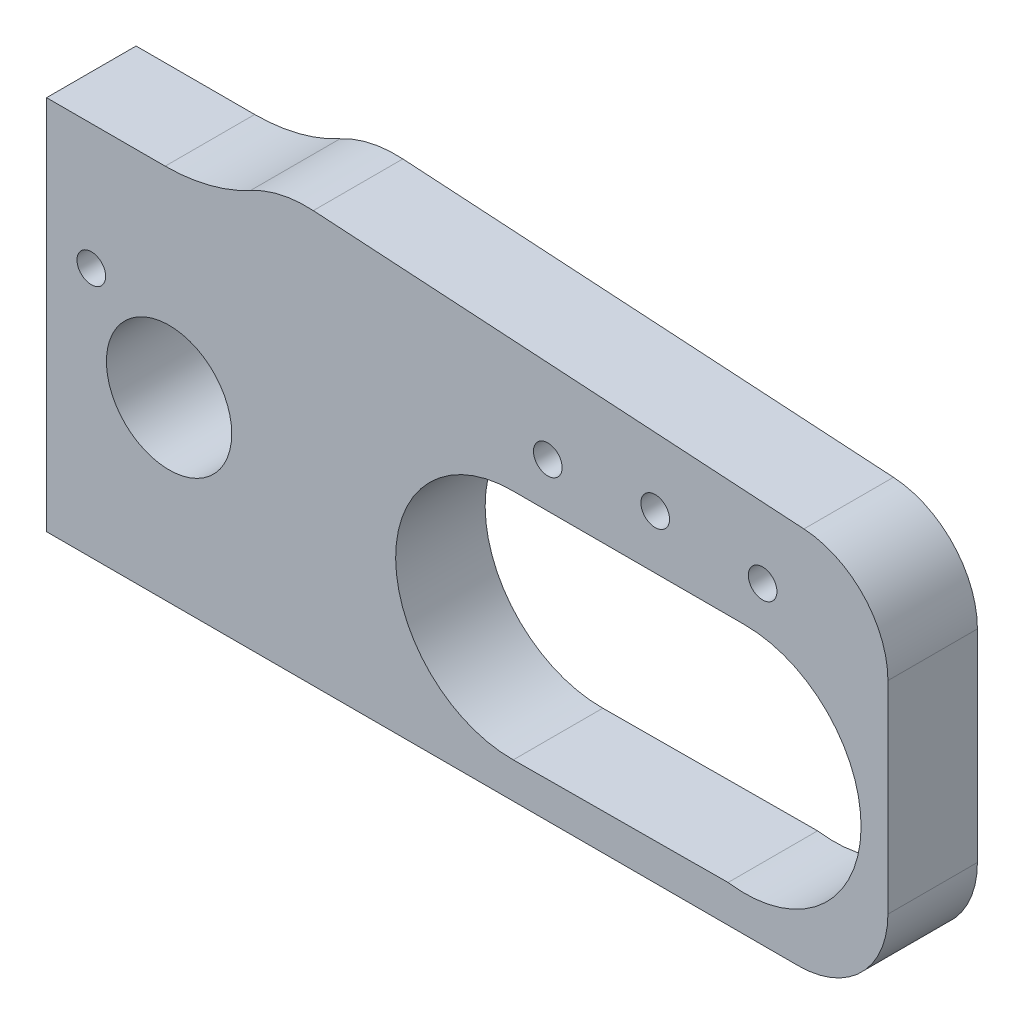
ISO-10303-21;
HEADER;
FILE_DESCRIPTION(('STEP AP214'),'2;1');
FILE_NAME('part.step','',(''),(''),'','','');
FILE_SCHEMA(('AUTOMOTIVE_DESIGN { 1 0 10303 214 1 1 1 1 }'));
ENDSEC;
DATA;
#1=APPLICATION_CONTEXT('core data for automotive mechanical design processes');
#2=APPLICATION_PROTOCOL_DEFINITION('international standard','automotive_design',2000,#1);
#3=PRODUCT_CONTEXT('',#1,'mechanical');
#4=PRODUCT('Part','Part','',(#3));
#5=PRODUCT_RELATED_PRODUCT_CATEGORY('part','',(#4));
#6=PRODUCT_DEFINITION_FORMATION('','',#4);
#7=PRODUCT_DEFINITION_CONTEXT('part definition',#1,'design');
#8=PRODUCT_DEFINITION('design','',#6,#7);
#9=PRODUCT_DEFINITION_SHAPE('','',#8);
#10=(LENGTH_UNIT() NAMED_UNIT(*) SI_UNIT(.MILLI.,.METRE.));
#11=(NAMED_UNIT(*) PLANE_ANGLE_UNIT() SI_UNIT($,.RADIAN.));
#12=(NAMED_UNIT(*) SI_UNIT($,.STERADIAN.) SOLID_ANGLE_UNIT());
#13=UNCERTAINTY_MEASURE_WITH_UNIT(LENGTH_MEASURE(1.E-05),#10,'distance_accuracy_value','');
#14=(GEOMETRIC_REPRESENTATION_CONTEXT(3) GLOBAL_UNCERTAINTY_ASSIGNED_CONTEXT((#13)) GLOBAL_UNIT_ASSIGNED_CONTEXT((#10,
#11,#12)) REPRESENTATION_CONTEXT('',''));
#15=CARTESIAN_POINT('',(0.,0.,0.));
#16=DIRECTION('',(0.,0.,1.));
#17=DIRECTION('',(1.,0.,0.));
#18=AXIS2_PLACEMENT_3D('',#15,#16,#17);
#19=CARTESIAN_POINT('',(-9.43815787852776,8.12368424294449,5.));
#20=DIRECTION('',(0.,0.,-1.));
#21=DIRECTION('',(-1.,0.,0.));
#22=AXIS2_PLACEMENT_3D('',#19,#20,#21);
#23=CYLINDRICAL_SURFACE('',#22,5.1);
#24=CARTESIAN_POINT('',(-9.43815787852776,8.12368424294449,0.));
#25=DIRECTION('',(0.,0.,1.));
#26=DIRECTION('',(1.,0.,0.));
#27=AXIS2_PLACEMENT_3D('',#24,#25,#26);
#28=CIRCLE('',#27,5.1);
#29=CARTESIAN_POINT('',(-4.33815787852776,8.12368424294449,0.));
#30=VERTEX_POINT('',#29);
#31=EDGE_CURVE('E183',#30,#30,#28,.T.);
#32=ORIENTED_EDGE('',*,*,#31,.F.);
#33=EDGE_LOOP('',(#32));
#34=FACE_BOUND('',#33,.T.);
#35=CARTESIAN_POINT('',(-9.43815787852776,8.12368424294449,4.));
#36=DIRECTION('',(0.,0.,1.));
#37=DIRECTION('',(1.,0.,0.));
#38=AXIS2_PLACEMENT_3D('',#35,#36,#37);
#39=CIRCLE('',#38,5.1);
#40=CARTESIAN_POINT('',(-4.33815787852776,8.12368424294449,4.));
#41=VERTEX_POINT('',#40);
#42=EDGE_CURVE('E398',#41,#41,#39,.T.);
#43=ORIENTED_EDGE('',*,*,#42,.T.);
#44=EDGE_LOOP('',(#43));
#45=FACE_BOUND('',#44,.T.);
#46=ADVANCED_FACE('F43',(#34,#45),#23,.F.);
#47=CARTESIAN_POINT('',(23.0618421214722,0.,5.));
#48=DIRECTION('',(1.,0.,0.));
#49=DIRECTION('',(0.,0.,-1.));
#50=AXIS2_PLACEMENT_3D('',#47,#48,#49);
#51=PLANE('',#50);
#52=DIRECTION('',(0.,-1.,0.));
#53=VECTOR('',#52,1.);
#54=CARTESIAN_POINT('',(23.0618421214722,0.,0.));
#55=LINE('',#54,#53);
#56=CARTESIAN_POINT('',(23.0618421214722,7.92371533758916,0.));
#57=VERTEX_POINT('',#56);
#58=CARTESIAN_POINT('',(23.0618421214722,-3.37631575705552,0.));
#59=VERTEX_POINT('',#58);
#60=EDGE_CURVE('E206',#57,#59,#55,.T.);
#61=ORIENTED_EDGE('',*,*,#60,.F.);
#62=DIRECTION('',(0.,0.,-1.));
#63=VECTOR('',#62,1.);
#64=CARTESIAN_POINT('',(23.0618421214722,7.92371533758916,5.));
#65=LINE('',#64,#63);
#66=CARTESIAN_POINT('',(23.0618421214722,7.92371533758916,5.));
#67=VERTEX_POINT('',#66);
#68=EDGE_CURVE('E11',#67,#57,#65,.T.);
#69=ORIENTED_EDGE('',*,*,#68,.F.);
#70=DIRECTION('',(0.,-1.,0.));
#71=VECTOR('',#70,1.);
#72=CARTESIAN_POINT('',(23.0618421214722,0.,5.));
#73=LINE('',#72,#71);
#74=CARTESIAN_POINT('',(23.0618421214722,-3.37631575705552,5.));
#75=VERTEX_POINT('',#74);
#76=EDGE_CURVE('E287',#67,#75,#73,.T.);
#77=ORIENTED_EDGE('',*,*,#76,.T.);
#78=DIRECTION('',(0.,0.,-1.));
#79=VECTOR('',#78,1.);
#80=CARTESIAN_POINT('',(23.0618421214722,-3.37631575705552,5.));
#81=LINE('',#80,#79);
#82=EDGE_CURVE('E115',#75,#59,#81,.T.);
#83=ORIENTED_EDGE('',*,*,#82,.T.);
#84=EDGE_LOOP('',(#61,#69,#77,#83));
#85=FACE_BOUND('',#84,.T.);
#86=ADVANCED_FACE('F323',(#85),#51,.T.);
#87=CARTESIAN_POINT('',(18.0618421214722,7.9237153375891,5.));
#88=DIRECTION('',(0.,0.,-1.));
#89=DIRECTION('',(-1.,0.,0.));
#90=AXIS2_PLACEMENT_3D('',#87,#88,#89);
#91=CYLINDRICAL_SURFACE('',#90,5.);
#92=CARTESIAN_POINT('',(18.0618421214722,7.9237153375891,0.));
#93=DIRECTION('',(0.,0.,1.));
#94=DIRECTION('',(1.,0.,0.));
#95=AXIS2_PLACEMENT_3D('',#92,#93,#94);
#96=CIRCLE('',#95,5.);
#97=CARTESIAN_POINT('',(18.3708578735485,12.9141571281492,0.));
#98=VERTEX_POINT('',#97);
#99=EDGE_CURVE('E212',#57,#98,#96,.T.);
#100=ORIENTED_EDGE('',*,*,#99,.T.);
#101=DIRECTION('',(0.,0.,-1.));
#102=VECTOR('',#101,1.);
#103=CARTESIAN_POINT('',(18.3708578735485,12.9141571281492,5.));
#104=LINE('',#103,#102);
#105=CARTESIAN_POINT('',(18.3708578735485,12.9141571281492,5.));
#106=VERTEX_POINT('',#105);
#107=EDGE_CURVE('E52',#106,#98,#104,.T.);
#108=ORIENTED_EDGE('',*,*,#107,.F.);
#109=CARTESIAN_POINT('',(18.0618421214722,7.9237153375891,5.));
#110=DIRECTION('',(0.,0.,1.));
#111=DIRECTION('',(1.,0.,0.));
#112=AXIS2_PLACEMENT_3D('',#109,#110,#111);
#113=CIRCLE('',#112,5.);
#114=EDGE_CURVE('E289',#67,#106,#113,.T.);
#115=ORIENTED_EDGE('',*,*,#114,.F.);
#116=ORIENTED_EDGE('',*,*,#68,.T.);
#117=EDGE_LOOP('',(#100,#108,#115,#116));
#118=FACE_BOUND('',#117,.T.);
#119=ADVANCED_FACE('F330',(#118),#91,.T.);
#120=CARTESIAN_POINT('',(0.866779714900697,13.9980362922802,5.));
#121=DIRECTION('',(-0.0618031504152585,-0.998088358112021,0.));
#122=DIRECTION('',(0.998088358112021,-0.0618031504152585,0.));
#123=AXIS2_PLACEMENT_3D('',#120,#121,#122);
#124=PLANE('',#123);
#125=DIRECTION('',(-0.998088358112021,0.0618031504152585,0.));
#126=VECTOR('',#125,1.);
#127=CARTESIAN_POINT('',(0.866779714900697,13.9980362922802,0.));
#128=LINE('',#127,#126);
#129=CARTESIAN_POINT('',(-9.03643740082861,14.6112585706726,0.));
#130=VERTEX_POINT('',#129);
#131=EDGE_CURVE('E211',#98,#130,#128,.T.);
#132=ORIENTED_EDGE('',*,*,#131,.T.);
#133=DIRECTION('',(0.,0.,-1.));
#134=VECTOR('',#133,1.);
#135=CARTESIAN_POINT('',(-9.03643740082861,14.6112585706726,5.));
#136=LINE('',#135,#134);
#137=CARTESIAN_POINT('',(-9.03643740082861,14.6112585706726,5.));
#138=VERTEX_POINT('',#137);
#139=EDGE_CURVE('E239',#138,#130,#136,.T.);
#140=ORIENTED_EDGE('',*,*,#139,.F.);
#141=DIRECTION('',(-0.998088358112021,0.0618031504152585,0.));
#142=VECTOR('',#141,1.);
#143=CARTESIAN_POINT('',(0.866779714900697,13.9980362922802,5.));
#144=LINE('',#143,#142);
#145=EDGE_CURVE('E291',#106,#138,#144,.T.);
#146=ORIENTED_EDGE('',*,*,#145,.F.);
#147=ORIENTED_EDGE('',*,*,#107,.T.);
#148=EDGE_LOOP('',(#132,#140,#146,#147));
#149=FACE_BOUND('',#148,.T.);
#150=ADVANCED_FACE('F358',(#149),#124,.F.);
#151=CARTESIAN_POINT('',(-9.43815787852776,8.12368424294449,5.));
#152=DIRECTION('',(0.,0.,-1.));
#153=DIRECTION('',(-1.,0.,0.));
#154=AXIS2_PLACEMENT_3D('',#151,#152,#153);
#155=CYLINDRICAL_SURFACE('',#154,6.49999999999999);
#156=CARTESIAN_POINT('',(-9.43815787852776,8.12368424294449,0.));
#157=DIRECTION('',(0.,0.,1.));
#158=DIRECTION('',(1.,0.,0.));
#159=AXIS2_PLACEMENT_3D('',#156,#157,#158);
#160=CIRCLE('',#159,6.49999999999999);
#161=CARTESIAN_POINT('',(-12.54003976829,13.8358054550657,0.));
#162=VERTEX_POINT('',#161);
#163=EDGE_CURVE('E220',#130,#162,#160,.T.);
#164=ORIENTED_EDGE('',*,*,#163,.T.);
#165=DIRECTION('',(0.,0.,-1.));
#166=VECTOR('',#165,1.);
#167=CARTESIAN_POINT('',(-12.54003976829,13.8358054550657,5.));
#168=LINE('',#167,#166);
#169=CARTESIAN_POINT('',(-12.54003976829,13.8358054550657,5.));
#170=VERTEX_POINT('',#169);
#171=EDGE_CURVE('E237',#170,#162,#168,.T.);
#172=ORIENTED_EDGE('',*,*,#171,.F.);
#173=CARTESIAN_POINT('',(-9.43815787852776,8.12368424294449,5.));
#174=DIRECTION('',(0.,0.,1.));
#175=DIRECTION('',(1.,0.,0.));
#176=AXIS2_PLACEMENT_3D('',#173,#174,#175);
#177=CIRCLE('',#176,6.49999999999999);
#178=EDGE_CURVE('E292',#138,#170,#177,.T.);
#179=ORIENTED_EDGE('',*,*,#178,.F.);
#180=ORIENTED_EDGE('',*,*,#139,.T.);
#181=EDGE_LOOP('',(#164,#172,#179,#180));
#182=FACE_BOUND('',#181,.T.);
#183=ADVANCED_FACE('F361',(#182),#155,.T.);
#184=CARTESIAN_POINT('',(-17.3121657525396,22.6236842429445,5.));
#185=DIRECTION('',(0.,0.,-1.));
#186=DIRECTION('',(-1.,0.,0.));
#187=AXIS2_PLACEMENT_3D('',#184,#185,#186);
#188=CYLINDRICAL_SURFACE('',#187,10.);
#189=CARTESIAN_POINT('',(-17.3121657525396,22.6236842429445,0.));
#190=DIRECTION('',(0.,0.,1.));
#191=DIRECTION('',(1.,0.,0.));
#192=AXIS2_PLACEMENT_3D('',#189,#190,#191);
#193=CIRCLE('',#192,10.);
#194=CARTESIAN_POINT('',(-17.3121657525395,12.6236842429445,0.));
#195=VERTEX_POINT('',#194);
#196=EDGE_CURVE('E219',#195,#162,#193,.T.);
#197=ORIENTED_EDGE('',*,*,#196,.F.);
#198=DIRECTION('',(0.,0.,-1.));
#199=VECTOR('',#198,1.);
#200=CARTESIAN_POINT('',(-17.3121657525395,12.6236842429445,5.));
#201=LINE('',#200,#199);
#202=CARTESIAN_POINT('',(-17.3121657525395,12.6236842429445,5.));
#203=VERTEX_POINT('',#202);
#204=EDGE_CURVE('E234',#203,#195,#201,.T.);
#205=ORIENTED_EDGE('',*,*,#204,.F.);
#206=CARTESIAN_POINT('',(-17.3121657525396,22.6236842429445,5.));
#207=DIRECTION('',(0.,0.,1.));
#208=DIRECTION('',(1.,0.,0.));
#209=AXIS2_PLACEMENT_3D('',#206,#207,#208);
#210=CIRCLE('',#209,10.);
#211=EDGE_CURVE('E175',#203,#170,#210,.T.);
#212=ORIENTED_EDGE('',*,*,#211,.T.);
#213=ORIENTED_EDGE('',*,*,#171,.T.);
#214=EDGE_LOOP('',(#197,#205,#212,#213));
#215=FACE_BOUND('',#214,.T.);
#216=ADVANCED_FACE('F298',(#215),#188,.F.);
#217=CARTESIAN_POINT('',(0.,12.6236842429445,5.));
#218=DIRECTION('',(0.,1.,0.));
#219=DIRECTION('',(-1.,0.,0.));
#220=AXIS2_PLACEMENT_3D('',#217,#218,#219);
#221=PLANE('',#220);
#222=DIRECTION('',(1.,0.,0.));
#223=VECTOR('',#222,1.);
#224=CARTESIAN_POINT('',(0.,12.6236842429445,0.));
#225=LINE('',#224,#223);
#226=CARTESIAN_POINT('',(-23.9381578785278,12.6236842429445,0.));
#227=VERTEX_POINT('',#226);
#228=EDGE_CURVE('E223',#227,#195,#225,.T.);
#229=ORIENTED_EDGE('',*,*,#228,.F.);
#230=DIRECTION('',(0.,0.,-1.));
#231=VECTOR('',#230,1.);
#232=CARTESIAN_POINT('',(-23.9381578785278,12.6236842429445,5.));
#233=LINE('',#232,#231);
#234=CARTESIAN_POINT('',(-23.9381578785278,12.6236842429445,5.));
#235=VERTEX_POINT('',#234);
#236=EDGE_CURVE('E159',#235,#227,#233,.T.);
#237=ORIENTED_EDGE('',*,*,#236,.F.);
#238=DIRECTION('',(1.,0.,0.));
#239=VECTOR('',#238,1.);
#240=CARTESIAN_POINT('',(0.,12.6236842429445,5.));
#241=LINE('',#240,#239);
#242=EDGE_CURVE('E169',#235,#203,#241,.T.);
#243=ORIENTED_EDGE('',*,*,#242,.T.);
#244=ORIENTED_EDGE('',*,*,#204,.T.);
#245=EDGE_LOOP('',(#229,#237,#243,#244));
#246=FACE_BOUND('',#245,.T.);
#247=ADVANCED_FACE('F304',(#246),#221,.T.);
#248=CARTESIAN_POINT('',(-23.9381578785278,0.,5.));
#249=DIRECTION('',(-1.,0.,0.));
#250=DIRECTION('',(0.,0.,1.));
#251=AXIS2_PLACEMENT_3D('',#248,#249,#250);
#252=PLANE('',#251);
#253=CARTESIAN_POINT('',(-23.9381578785278,9.62368424294448,2.5));
#254=DIRECTION('',(-1.,0.,0.));
#255=DIRECTION('',(0.,0.,1.));
#256=AXIS2_PLACEMENT_3D('',#253,#254,#255);
#257=CIRCLE('',#256,1.25);
#258=CARTESIAN_POINT('',(-23.9381578785278,9.62368424294448,3.75));
#259=VERTEX_POINT('',#258);
#260=EDGE_CURVE('E403',#259,#259,#257,.T.);
#261=ORIENTED_EDGE('',*,*,#260,.F.);
#262=EDGE_LOOP('',(#261));
#263=FACE_BOUND('',#262,.T.);
#264=CARTESIAN_POINT('',(-23.9381578785278,-2.87631575705552,2.5));
#265=DIRECTION('',(-1.,0.,0.));
#266=DIRECTION('',(0.,0.,1.));
#267=AXIS2_PLACEMENT_3D('',#264,#265,#266);
#268=CIRCLE('',#267,1.25);
#269=CARTESIAN_POINT('',(-23.9381578785278,-2.87631575705552,3.75));
#270=VERTEX_POINT('',#269);
#271=EDGE_CURVE('E400',#270,#270,#268,.T.);
#272=ORIENTED_EDGE('',*,*,#271,.F.);
#273=EDGE_LOOP('',(#272));
#274=FACE_BOUND('',#273,.T.);
#275=DIRECTION('',(0.,1.,0.));
#276=VECTOR('',#275,1.);
#277=CARTESIAN_POINT('',(-23.9381578785278,0.,0.));
#278=LINE('',#277,#276);
#279=CARTESIAN_POINT('',(-23.9381578785278,-8.37631575705552,0.));
#280=VERTEX_POINT('',#279);
#281=EDGE_CURVE('E157',#280,#227,#278,.T.);
#282=ORIENTED_EDGE('',*,*,#281,.F.);
#283=DIRECTION('',(0.,0.,-1.));
#284=VECTOR('',#283,1.);
#285=CARTESIAN_POINT('',(-23.9381578785278,-8.37631575705552,5.));
#286=LINE('',#285,#284);
#287=CARTESIAN_POINT('',(-23.9381578785278,-8.37631575705552,5.));
#288=VERTEX_POINT('',#287);
#289=EDGE_CURVE('E146',#288,#280,#286,.T.);
#290=ORIENTED_EDGE('',*,*,#289,.F.);
#291=DIRECTION('',(0.,1.,0.));
#292=VECTOR('',#291,1.);
#293=CARTESIAN_POINT('',(-23.9381578785278,0.,5.));
#294=LINE('',#293,#292);
#295=EDGE_CURVE('E155',#288,#235,#294,.T.);
#296=ORIENTED_EDGE('',*,*,#295,.T.);
#297=ORIENTED_EDGE('',*,*,#236,.T.);
#298=EDGE_LOOP('',(#282,#290,#296,#297));
#299=FACE_BOUND('',#298,.T.);
#300=ADVANCED_FACE('F154',(#263,#274,#299),#252,.T.);
#301=CARTESIAN_POINT('',(0.,-8.37631575705552,5.));
#302=DIRECTION('',(0.,1.,0.));
#303=DIRECTION('',(-1.,0.,0.));
#304=AXIS2_PLACEMENT_3D('',#301,#302,#303);
#305=PLANE('',#304);
#306=DIRECTION('',(1.,0.,0.));
#307=VECTOR('',#306,1.);
#308=CARTESIAN_POINT('',(0.,-8.37631575705552,0.));
#309=LINE('',#308,#307);
#310=CARTESIAN_POINT('',(18.0618421214723,-8.37631575705552,0.));
#311=VERTEX_POINT('',#310);
#312=EDGE_CURVE('E229',#280,#311,#309,.T.);
#313=ORIENTED_EDGE('',*,*,#312,.T.);
#314=DIRECTION('',(0.,0.,-1.));
#315=VECTOR('',#314,1.);
#316=CARTESIAN_POINT('',(18.0618421214723,-8.37631575705552,5.));
#317=LINE('',#316,#315);
#318=CARTESIAN_POINT('',(18.0618421214723,-8.37631575705552,5.));
#319=VERTEX_POINT('',#318);
#320=EDGE_CURVE('E158',#319,#311,#317,.T.);
#321=ORIENTED_EDGE('',*,*,#320,.F.);
#322=DIRECTION('',(1.,0.,0.));
#323=VECTOR('',#322,1.);
#324=CARTESIAN_POINT('',(0.,-8.37631575705552,5.));
#325=LINE('',#324,#323);
#326=EDGE_CURVE('E164',#288,#319,#325,.T.);
#327=ORIENTED_EDGE('',*,*,#326,.F.);
#328=ORIENTED_EDGE('',*,*,#289,.T.);
#329=EDGE_LOOP('',(#313,#321,#327,#328));
#330=FACE_BOUND('',#329,.T.);
#331=ADVANCED_FACE('F161',(#330),#305,.F.);
#332=CARTESIAN_POINT('',(15.0618421214712,0.123684242944485,5.));
#333=DIRECTION('',(0.,0.,-1.));
#334=DIRECTION('',(-1.,0.,0.));
#335=AXIS2_PLACEMENT_3D('',#332,#333,#334);
#336=CYLINDRICAL_SURFACE('',#335,6.5);
#337=CARTESIAN_POINT('',(15.0618421214712,0.123684242944485,0.));
#338=DIRECTION('',(0.,0.,1.));
#339=DIRECTION('',(1.,0.,0.));
#340=AXIS2_PLACEMENT_3D('',#337,#338,#339);
#341=CIRCLE('',#340,6.5);
#342=CARTESIAN_POINT('',(14.1329018950054,-6.30959408584354,0.));
#343=VERTEX_POINT('',#342);
#344=CARTESIAN_POINT('',(15.0618421214722,6.62368424294448,0.));
#345=VERTEX_POINT('',#344);
#346=EDGE_CURVE('E184',#343,#345,#341,.T.);
#347=ORIENTED_EDGE('',*,*,#346,.F.);
#348=DIRECTION('',(0.,0.,-1.));
#349=VECTOR('',#348,1.);
#350=CARTESIAN_POINT('',(14.1329018950054,-6.30959408584354,5.));
#351=LINE('',#350,#349);
#352=CARTESIAN_POINT('',(14.1329018950054,-6.30959408584354,5.));
#353=VERTEX_POINT('',#352);
#354=EDGE_CURVE('E50',#353,#343,#351,.T.);
#355=ORIENTED_EDGE('',*,*,#354,.F.);
#356=CARTESIAN_POINT('',(15.0618421214712,0.123684242944485,5.));
#357=DIRECTION('',(0.,0.,1.));
#358=DIRECTION('',(1.,0.,0.));
#359=AXIS2_PLACEMENT_3D('',#356,#357,#358);
#360=CIRCLE('',#359,6.5);
#361=CARTESIAN_POINT('',(15.0618421214722,6.62368424294448,5.));
#362=VERTEX_POINT('',#361);
#363=EDGE_CURVE('E388',#353,#362,#360,.T.);
#364=ORIENTED_EDGE('',*,*,#363,.T.);
#365=DIRECTION('',(0.,0.,-1.));
#366=VECTOR('',#365,1.);
#367=CARTESIAN_POINT('',(15.0618421214722,6.62368424294448,5.));
#368=LINE('',#367,#366);
#369=EDGE_CURVE('E179',#362,#345,#368,.T.);
#370=ORIENTED_EDGE('',*,*,#369,.T.);
#371=EDGE_LOOP('',(#347,#355,#364,#370));
#372=FACE_BOUND('',#371,.T.);
#373=ADVANCED_FACE('F251',(#372),#336,.F.);
#374=CARTESIAN_POINT('',(0.035306413320846,-6.38751724654818,5.));
#375=DIRECTION('',(-0.00552732346942933,0.999984724230958,0.));
#376=DIRECTION('',(-0.999984724230958,-0.00552732346942933,0.));
#377=AXIS2_PLACEMENT_3D('',#374,#375,#376);
#378=PLANE('',#377);
#379=DIRECTION('',(0.999984724230958,0.00552732346942933,0.));
#380=VECTOR('',#379,1.);
#381=CARTESIAN_POINT('',(0.035306413320846,-6.38751724654818,0.));
#382=LINE('',#381,#380);
#383=CARTESIAN_POINT('',(2.13369622893157,-6.37591859009395,0.));
#384=VERTEX_POINT('',#383);
#385=EDGE_CURVE('E186',#384,#343,#382,.T.);
#386=ORIENTED_EDGE('',*,*,#385,.F.);
#387=DIRECTION('',(0.,0.,-1.));
#388=VECTOR('',#387,1.);
#389=CARTESIAN_POINT('',(2.13369622893157,-6.37591859009395,5.));
#390=LINE('',#389,#388);
#391=CARTESIAN_POINT('',(2.13369622893157,-6.37591859009395,5.));
#392=VERTEX_POINT('',#391);
#393=EDGE_CURVE('E244',#392,#384,#390,.T.);
#394=ORIENTED_EDGE('',*,*,#393,.F.);
#395=DIRECTION('',(0.999984724230958,0.00552732346942933,0.));
#396=VECTOR('',#395,1.);
#397=CARTESIAN_POINT('',(0.035306413320846,-6.38751724654818,5.));
#398=LINE('',#397,#396);
#399=EDGE_CURVE('E255',#392,#353,#398,.T.);
#400=ORIENTED_EDGE('',*,*,#399,.T.);
#401=ORIENTED_EDGE('',*,*,#354,.T.);
#402=EDGE_LOOP('',(#386,#394,#400,#401));
#403=FACE_BOUND('',#402,.T.);
#404=ADVANCED_FACE('F254',(#403),#378,.T.);
#405=CARTESIAN_POINT('',(2.06184212147224,0.123684242944485,5.));
#406=DIRECTION('',(0.,0.,-1.));
#407=DIRECTION('',(-1.,0.,0.));
#408=AXIS2_PLACEMENT_3D('',#405,#406,#407);
#409=CYLINDRICAL_SURFACE('',#408,6.5);
#410=CARTESIAN_POINT('',(2.06184212147224,0.123684242944485,0.));
#411=DIRECTION('',(0.,0.,1.));
#412=DIRECTION('',(1.,0.,0.));
#413=AXIS2_PLACEMENT_3D('',#410,#411,#412);
#414=CIRCLE('',#413,6.5);
#415=CARTESIAN_POINT('',(2.06184212147224,6.62368424294448,0.));
#416=VERTEX_POINT('',#415);
#417=EDGE_CURVE('E191',#416,#384,#414,.T.);
#418=ORIENTED_EDGE('',*,*,#417,.F.);
#419=DIRECTION('',(0.,0.,-1.));
#420=VECTOR('',#419,1.);
#421=CARTESIAN_POINT('',(2.06184212147224,6.62368424294448,5.));
#422=LINE('',#421,#420);
#423=CARTESIAN_POINT('',(2.06184212147224,6.62368424294448,5.));
#424=VERTEX_POINT('',#423);
#425=EDGE_CURVE('E242',#424,#416,#422,.T.);
#426=ORIENTED_EDGE('',*,*,#425,.F.);
#427=CARTESIAN_POINT('',(2.06184212147224,0.123684242944485,5.));
#428=DIRECTION('',(0.,0.,1.));
#429=DIRECTION('',(1.,0.,0.));
#430=AXIS2_PLACEMENT_3D('',#427,#428,#429);
#431=CIRCLE('',#430,6.5);
#432=EDGE_CURVE('E265',#424,#392,#431,.T.);
#433=ORIENTED_EDGE('',*,*,#432,.T.);
#434=ORIENTED_EDGE('',*,*,#393,.T.);
#435=EDGE_LOOP('',(#418,#426,#433,#434));
#436=FACE_BOUND('',#435,.T.);
#437=ADVANCED_FACE('F259',(#436),#409,.F.);
#438=CARTESIAN_POINT('',(-21.4381578785278,5.62368424294448,5.));
#439=DIRECTION('',(0.,0.,-1.));
#440=DIRECTION('',(-1.,0.,0.));
#441=AXIS2_PLACEMENT_3D('',#438,#439,#440);
#442=CYLINDRICAL_SURFACE('',#441,0.8);
#443=CARTESIAN_POINT('',(-21.4381578785278,5.62368424294448,5.));
#444=DIRECTION('',(0.,0.,1.));
#445=DIRECTION('',(1.,0.,0.));
#446=AXIS2_PLACEMENT_3D('',#443,#444,#445);
#447=CIRCLE('',#446,0.8);
#448=CARTESIAN_POINT('',(-20.6381578785278,5.62368424294448,5.));
#449=VERTEX_POINT('',#448);
#450=EDGE_CURVE('E284',#449,#449,#447,.T.);
#451=ORIENTED_EDGE('',*,*,#450,.T.);
#452=EDGE_LOOP('',(#451));
#453=FACE_BOUND('',#452,.T.);
#454=CARTESIAN_POINT('',(-21.4381578785278,5.62368424294448,0.));
#455=DIRECTION('',(0.,0.,1.));
#456=DIRECTION('',(1.,0.,0.));
#457=AXIS2_PLACEMENT_3D('',#454,#455,#456);
#458=CIRCLE('',#457,0.8);
#459=CARTESIAN_POINT('',(-20.6381578785278,5.62368424294448,0.));
#460=VERTEX_POINT('',#459);
#461=EDGE_CURVE('E207',#460,#460,#458,.T.);
#462=ORIENTED_EDGE('',*,*,#461,.F.);
#463=EDGE_LOOP('',(#462));
#464=FACE_BOUND('',#463,.T.);
#465=ADVANCED_FACE('F337',(#453,#464),#442,.F.);
#466=CARTESIAN_POINT('',(4.06184212147224,9.12368424294448,5.));
#467=DIRECTION('',(0.,0.,-1.));
#468=DIRECTION('',(-1.,0.,0.));
#469=AXIS2_PLACEMENT_3D('',#466,#467,#468);
#470=CYLINDRICAL_SURFACE('',#469,0.800000000000001);
#471=CARTESIAN_POINT('',(4.06184212147224,9.12368424294448,5.));
#472=DIRECTION('',(0.,0.,1.));
#473=DIRECTION('',(1.,0.,0.));
#474=AXIS2_PLACEMENT_3D('',#471,#472,#473);
#475=CIRCLE('',#474,0.800000000000001);
#476=CARTESIAN_POINT('',(4.86184212147224,9.12368424294448,5.));
#477=VERTEX_POINT('',#476);
#478=EDGE_CURVE('E279',#477,#477,#475,.T.);
#479=ORIENTED_EDGE('',*,*,#478,.T.);
#480=EDGE_LOOP('',(#479));
#481=FACE_BOUND('',#480,.T.);
#482=CARTESIAN_POINT('',(4.06184212147224,9.12368424294448,0.));
#483=DIRECTION('',(0.,0.,1.));
#484=DIRECTION('',(1.,0.,0.));
#485=AXIS2_PLACEMENT_3D('',#482,#483,#484);
#486=CIRCLE('',#485,0.800000000000001);
#487=CARTESIAN_POINT('',(4.86184212147224,9.12368424294448,0.));
#488=VERTEX_POINT('',#487);
#489=EDGE_CURVE('E202',#488,#488,#486,.T.);
#490=ORIENTED_EDGE('',*,*,#489,.F.);
#491=EDGE_LOOP('',(#490));
#492=FACE_BOUND('',#491,.T.);
#493=ADVANCED_FACE('F349',(#481,#492),#470,.F.);
#494=CARTESIAN_POINT('',(10.0618421214722,9.62368424294448,5.));
#495=DIRECTION('',(0.,0.,-1.));
#496=DIRECTION('',(-1.,0.,0.));
#497=AXIS2_PLACEMENT_3D('',#494,#495,#496);
#498=CYLINDRICAL_SURFACE('',#497,0.800000000000002);
#499=CARTESIAN_POINT('',(10.0618421214722,9.62368424294448,5.));
#500=DIRECTION('',(0.,0.,1.));
#501=DIRECTION('',(1.,0.,0.));
#502=AXIS2_PLACEMENT_3D('',#499,#500,#501);
#503=CIRCLE('',#502,0.800000000000002);
#504=CARTESIAN_POINT('',(10.8618421214722,9.62368424294448,5.));
#505=VERTEX_POINT('',#504);
#506=EDGE_CURVE('E272',#505,#505,#503,.T.);
#507=ORIENTED_EDGE('',*,*,#506,.T.);
#508=EDGE_LOOP('',(#507));
#509=FACE_BOUND('',#508,.T.);
#510=CARTESIAN_POINT('',(10.0618421214722,9.62368424294448,0.));
#511=DIRECTION('',(0.,0.,1.));
#512=DIRECTION('',(1.,0.,0.));
#513=AXIS2_PLACEMENT_3D('',#510,#511,#512);
#514=CIRCLE('',#513,0.800000000000002);
#515=CARTESIAN_POINT('',(10.8618421214722,9.62368424294448,0.));
#516=VERTEX_POINT('',#515);
#517=EDGE_CURVE('E199',#516,#516,#514,.T.);
#518=ORIENTED_EDGE('',*,*,#517,.F.);
#519=EDGE_LOOP('',(#518));
#520=FACE_BOUND('',#519,.T.);
#521=ADVANCED_FACE('F346',(#509,#520),#498,.F.);
#522=CARTESIAN_POINT('',(16.0618421214722,9.12368424294448,5.));
#523=DIRECTION('',(0.,0.,-1.));
#524=DIRECTION('',(-1.,0.,0.));
#525=AXIS2_PLACEMENT_3D('',#522,#523,#524);
#526=CYLINDRICAL_SURFACE('',#525,0.8);
#527=CARTESIAN_POINT('',(16.0618421214722,9.12368424294448,5.));
#528=DIRECTION('',(0.,0.,1.));
#529=DIRECTION('',(1.,0.,0.));
#530=AXIS2_PLACEMENT_3D('',#527,#528,#529);
#531=CIRCLE('',#530,0.8);
#532=CARTESIAN_POINT('',(16.8618421214722,9.12368424294448,5.));
#533=VERTEX_POINT('',#532);
#534=EDGE_CURVE('E271',#533,#533,#531,.T.);
#535=ORIENTED_EDGE('',*,*,#534,.T.);
#536=EDGE_LOOP('',(#535));
#537=FACE_BOUND('',#536,.T.);
#538=CARTESIAN_POINT('',(16.0618421214722,9.12368424294448,0.));
#539=DIRECTION('',(0.,0.,1.));
#540=DIRECTION('',(1.,0.,0.));
#541=AXIS2_PLACEMENT_3D('',#538,#539,#540);
#542=CIRCLE('',#541,0.8);
#543=CARTESIAN_POINT('',(16.8618421214722,9.12368424294448,0.));
#544=VERTEX_POINT('',#543);
#545=EDGE_CURVE('E200',#544,#544,#542,.T.);
#546=ORIENTED_EDGE('',*,*,#545,.F.);
#547=EDGE_LOOP('',(#546));
#548=FACE_BOUND('',#547,.T.);
#549=ADVANCED_FACE('F343',(#537,#548),#526,.F.);
#550=CARTESIAN_POINT('',(0.,6.62368424294448,5.));
#551=DIRECTION('',(0.,-1.,0.));
#552=DIRECTION('',(0.,0.,-1.));
#553=AXIS2_PLACEMENT_3D('',#550,#551,#552);
#554=PLANE('',#553);
#555=DIRECTION('',(-1.,0.,0.));
#556=VECTOR('',#555,1.);
#557=CARTESIAN_POINT('',(0.,6.62368424294448,0.));
#558=LINE('',#557,#556);
#559=EDGE_CURVE('E192',#345,#416,#558,.T.);
#560=ORIENTED_EDGE('',*,*,#559,.F.);
#561=ORIENTED_EDGE('',*,*,#369,.F.);
#562=DIRECTION('',(-1.,0.,0.));
#563=VECTOR('',#562,1.);
#564=CARTESIAN_POINT('',(0.,6.62368424294448,5.));
#565=LINE('',#564,#563);
#566=EDGE_CURVE('E268',#362,#424,#565,.T.);
#567=ORIENTED_EDGE('',*,*,#566,.T.);
#568=ORIENTED_EDGE('',*,*,#425,.T.);
#569=EDGE_LOOP('',(#560,#561,#567,#568));
#570=FACE_BOUND('',#569,.T.);
#571=ADVANCED_FACE('F269',(#570),#554,.T.);
#572=CARTESIAN_POINT('',(-17.0949123880256,1.5370226924151,5.));
#573=DIRECTION('',(0.,0.,-1.));
#574=DIRECTION('',(-1.,0.,0.));
#575=AXIS2_PLACEMENT_3D('',#572,#573,#574);
#576=CYLINDRICAL_SURFACE('',#575,3.49999999999997);
#577=CARTESIAN_POINT('',(-17.0949123880256,1.5370226924151,5.));
#578=DIRECTION('',(0.,0.,1.));
#579=DIRECTION('',(1.,0.,0.));
#580=AXIS2_PLACEMENT_3D('',#577,#578,#579);
#581=CIRCLE('',#580,3.49999999999997);
#582=CARTESIAN_POINT('',(-13.5949123880256,1.5370226924151,5.));
#583=VERTEX_POINT('',#582);
#584=EDGE_CURVE('E226',#583,#583,#581,.T.);
#585=ORIENTED_EDGE('',*,*,#584,.T.);
#586=EDGE_LOOP('',(#585));
#587=FACE_BOUND('',#586,.T.);
#588=CARTESIAN_POINT('',(-17.0949123880256,1.5370226924151,0.));
#589=DIRECTION('',(0.,0.,1.));
#590=DIRECTION('',(1.,0.,0.));
#591=AXIS2_PLACEMENT_3D('',#588,#589,#590);
#592=CIRCLE('',#591,3.49999999999997);
#593=CARTESIAN_POINT('',(-13.5949123880256,1.5370226924151,0.));
#594=VERTEX_POINT('',#593);
#595=EDGE_CURVE('E177',#594,#594,#592,.T.);
#596=ORIENTED_EDGE('',*,*,#595,.F.);
#597=EDGE_LOOP('',(#596));
#598=FACE_BOUND('',#597,.T.);
#599=ADVANCED_FACE('F44',(#587,#598),#576,.F.);
#600=CARTESIAN_POINT('',(18.0618421214722,-3.37631575705552,5.));
#601=DIRECTION('',(0.,0.,-1.));
#602=DIRECTION('',(-1.,0.,0.));
#603=AXIS2_PLACEMENT_3D('',#600,#601,#602);
#604=CYLINDRICAL_SURFACE('',#603,5.);
#605=CARTESIAN_POINT('',(18.0618421214722,-3.37631575705552,0.));
#606=DIRECTION('',(0.,0.,1.));
#607=DIRECTION('',(1.,0.,0.));
#608=AXIS2_PLACEMENT_3D('',#605,#606,#607);
#609=CIRCLE('',#608,5.);
#610=EDGE_CURVE('E101',#311,#59,#609,.T.);
#611=ORIENTED_EDGE('',*,*,#610,.T.);
#612=ORIENTED_EDGE('',*,*,#82,.F.);
#613=CARTESIAN_POINT('',(18.0618421214722,-3.37631575705552,5.));
#614=DIRECTION('',(0.,0.,1.));
#615=DIRECTION('',(1.,0.,0.));
#616=AXIS2_PLACEMENT_3D('',#613,#614,#615);
#617=CIRCLE('',#616,5.);
#618=EDGE_CURVE('E65',#319,#75,#617,.T.);
#619=ORIENTED_EDGE('',*,*,#618,.F.);
#620=ORIENTED_EDGE('',*,*,#320,.T.);
#621=EDGE_LOOP('',(#611,#612,#619,#620));
#622=FACE_BOUND('',#621,.T.);
#623=ADVANCED_FACE('F320',(#622),#604,.T.);
#624=CARTESIAN_POINT('',(0.,0.,5.));
#625=DIRECTION('',(0.,0.,1.));
#626=DIRECTION('',(1.,0.,0.));
#627=AXIS2_PLACEMENT_3D('',#624,#625,#626);
#628=PLANE('',#627);
#629=ORIENTED_EDGE('',*,*,#584,.F.);
#630=EDGE_LOOP('',(#629));
#631=FACE_BOUND('',#630,.T.);
#632=ORIENTED_EDGE('',*,*,#363,.F.);
#633=ORIENTED_EDGE('',*,*,#399,.F.);
#634=ORIENTED_EDGE('',*,*,#432,.F.);
#635=ORIENTED_EDGE('',*,*,#566,.F.);
#636=EDGE_LOOP('',(#632,#633,#634,#635));
#637=FACE_BOUND('',#636,.T.);
#638=ORIENTED_EDGE('',*,*,#534,.F.);
#639=EDGE_LOOP('',(#638));
#640=FACE_BOUND('',#639,.T.);
#641=ORIENTED_EDGE('',*,*,#506,.F.);
#642=EDGE_LOOP('',(#641));
#643=FACE_BOUND('',#642,.T.);
#644=ORIENTED_EDGE('',*,*,#478,.F.);
#645=EDGE_LOOP('',(#644));
#646=FACE_BOUND('',#645,.T.);
#647=ORIENTED_EDGE('',*,*,#450,.F.);
#648=EDGE_LOOP('',(#647));
#649=FACE_BOUND('',#648,.T.);
#650=ORIENTED_EDGE('',*,*,#76,.F.);
#651=ORIENTED_EDGE('',*,*,#114,.T.);
#652=ORIENTED_EDGE('',*,*,#145,.T.);
#653=ORIENTED_EDGE('',*,*,#178,.T.);
#654=ORIENTED_EDGE('',*,*,#211,.F.);
#655=ORIENTED_EDGE('',*,*,#242,.F.);
#656=ORIENTED_EDGE('',*,*,#295,.F.);
#657=ORIENTED_EDGE('',*,*,#326,.T.);
#658=ORIENTED_EDGE('',*,*,#618,.T.);
#659=EDGE_LOOP('',(#650,#651,#652,#653,#654,#655,#656,#657,#658));
#660=FACE_BOUND('',#659,.T.);
#661=ADVANCED_FACE('F170',(#631,#637,#640,#643,#646,#649,#660),#628,.T.);
#662=CARTESIAN_POINT('',(0.,0.,0.));
#663=DIRECTION('',(0.,0.,1.));
#664=DIRECTION('',(1.,0.,0.));
#665=AXIS2_PLACEMENT_3D('',#662,#663,#664);
#666=PLANE('',#665);
#667=ORIENTED_EDGE('',*,*,#595,.T.);
#668=EDGE_LOOP('',(#667));
#669=FACE_BOUND('',#668,.T.);
#670=ORIENTED_EDGE('',*,*,#31,.T.);
#671=EDGE_LOOP('',(#670));
#672=FACE_BOUND('',#671,.T.);
#673=ORIENTED_EDGE('',*,*,#346,.T.);
#674=ORIENTED_EDGE('',*,*,#559,.T.);
#675=ORIENTED_EDGE('',*,*,#417,.T.);
#676=ORIENTED_EDGE('',*,*,#385,.T.);
#677=EDGE_LOOP('',(#673,#674,#675,#676));
#678=FACE_BOUND('',#677,.T.);
#679=ORIENTED_EDGE('',*,*,#545,.T.);
#680=EDGE_LOOP('',(#679));
#681=FACE_BOUND('',#680,.T.);
#682=ORIENTED_EDGE('',*,*,#517,.T.);
#683=EDGE_LOOP('',(#682));
#684=FACE_BOUND('',#683,.T.);
#685=ORIENTED_EDGE('',*,*,#489,.T.);
#686=EDGE_LOOP('',(#685));
#687=FACE_BOUND('',#686,.T.);
#688=ORIENTED_EDGE('',*,*,#461,.T.);
#689=EDGE_LOOP('',(#688));
#690=FACE_BOUND('',#689,.T.);
#691=ORIENTED_EDGE('',*,*,#60,.T.);
#692=ORIENTED_EDGE('',*,*,#610,.F.);
#693=ORIENTED_EDGE('',*,*,#312,.F.);
#694=ORIENTED_EDGE('',*,*,#281,.T.);
#695=ORIENTED_EDGE('',*,*,#228,.T.);
#696=ORIENTED_EDGE('',*,*,#196,.T.);
#697=ORIENTED_EDGE('',*,*,#163,.F.);
#698=ORIENTED_EDGE('',*,*,#131,.F.);
#699=ORIENTED_EDGE('',*,*,#99,.F.);
#700=EDGE_LOOP('',(#691,#692,#693,#694,#695,#696,#697,#698,#699));
#701=FACE_BOUND('',#700,.T.);
#702=ADVANCED_FACE('F256',(#669,#672,#678,#681,#684,#687,#690,#701),#666,.F.);
#703=CARTESIAN_POINT('',(-19.9381578785278,-2.87631575705552,2.5));
#704=DIRECTION('',(-1.,0.,0.));
#705=DIRECTION('',(0.,0.,1.));
#706=AXIS2_PLACEMENT_3D('',#703,#704,#705);
#707=CYLINDRICAL_SURFACE('',#706,1.25);
#708=CARTESIAN_POINT('',(-19.9381578785278,-2.87631575705552,2.5));
#709=DIRECTION('',(-1.,0.,0.));
#710=DIRECTION('',(0.,0.,1.));
#711=AXIS2_PLACEMENT_3D('',#708,#709,#710);
#712=CIRCLE('',#711,1.25);
#713=CARTESIAN_POINT('',(-19.9381578785278,-2.87631575705552,3.75));
#714=VERTEX_POINT('',#713);
#715=EDGE_CURVE('E392',#714,#714,#712,.T.);
#716=ORIENTED_EDGE('',*,*,#715,.F.);
#717=EDGE_LOOP('',(#716));
#718=FACE_BOUND('',#717,.T.);
#719=ORIENTED_EDGE('',*,*,#271,.T.);
#720=EDGE_LOOP('',(#719));
#721=FACE_BOUND('',#720,.T.);
#722=ADVANCED_FACE('F301',(#718,#721),#707,.F.);
#723=CARTESIAN_POINT('',(-19.9381578785278,-2.87631575705552,2.5));
#724=DIRECTION('',(-1.,0.,0.));
#725=DIRECTION('',(0.,0.,1.));
#726=AXIS2_PLACEMENT_3D('',#723,#724,#725);
#727=PLANE('',#726);
#728=ORIENTED_EDGE('',*,*,#715,.T.);
#729=EDGE_LOOP('',(#728));
#730=FACE_BOUND('',#729,.T.);
#731=ADVANCED_FACE('F314',(#730),#727,.T.);
#732=CARTESIAN_POINT('',(-19.9381578785278,9.62368424294448,2.5));
#733=DIRECTION('',(-1.,0.,0.));
#734=DIRECTION('',(0.,0.,1.));
#735=AXIS2_PLACEMENT_3D('',#732,#733,#734);
#736=CYLINDRICAL_SURFACE('',#735,1.25);
#737=CARTESIAN_POINT('',(-19.9381578785278,9.62368424294448,2.5));
#738=DIRECTION('',(-1.,0.,0.));
#739=DIRECTION('',(0.,0.,1.));
#740=AXIS2_PLACEMENT_3D('',#737,#738,#739);
#741=CIRCLE('',#740,1.25);
#742=CARTESIAN_POINT('',(-19.9381578785278,9.62368424294448,3.75));
#743=VERTEX_POINT('',#742);
#744=EDGE_CURVE('E182',#743,#743,#741,.T.);
#745=ORIENTED_EDGE('',*,*,#744,.F.);
#746=EDGE_LOOP('',(#745));
#747=FACE_BOUND('',#746,.T.);
#748=ORIENTED_EDGE('',*,*,#260,.T.);
#749=EDGE_LOOP('',(#748));
#750=FACE_BOUND('',#749,.T.);
#751=ADVANCED_FACE('F412',(#747,#750),#736,.F.);
#752=CARTESIAN_POINT('',(-19.9381578785278,9.62368424294448,2.5));
#753=DIRECTION('',(-1.,0.,0.));
#754=DIRECTION('',(0.,0.,1.));
#755=AXIS2_PLACEMENT_3D('',#752,#753,#754);
#756=PLANE('',#755);
#757=ORIENTED_EDGE('',*,*,#744,.T.);
#758=EDGE_LOOP('',(#757));
#759=FACE_BOUND('',#758,.T.);
#760=ADVANCED_FACE('F413',(#759),#756,.T.);
#761=CARTESIAN_POINT('',(-9.43815787852776,8.12368424294449,4.));
#762=DIRECTION('',(0.,0.,1.));
#763=DIRECTION('',(1.,0.,0.));
#764=AXIS2_PLACEMENT_3D('',#761,#762,#763);
#765=PLANE('',#764);
#766=ORIENTED_EDGE('',*,*,#42,.F.);
#767=EDGE_LOOP('',(#766));
#768=FACE_BOUND('',#767,.T.);
#769=ADVANCED_FACE('F410',(#768),#765,.F.);
#770=CLOSED_SHELL('',(#46,#86,#119,#150,#183,#216,#247,#300,#331,#373,#404,#437,#465,#493,#521,
#549,#571,#599,#623,#661,#702,#722,#731,#751,#760,#769));
#771=MANIFOLD_SOLID_BREP('B2',#770);
#772=ADVANCED_BREP_SHAPE_REPRESENTATION('',(#18,#771),#14);
#773=SHAPE_DEFINITION_REPRESENTATION(#9,#772);
ENDSEC;
END-ISO-10303-21;
